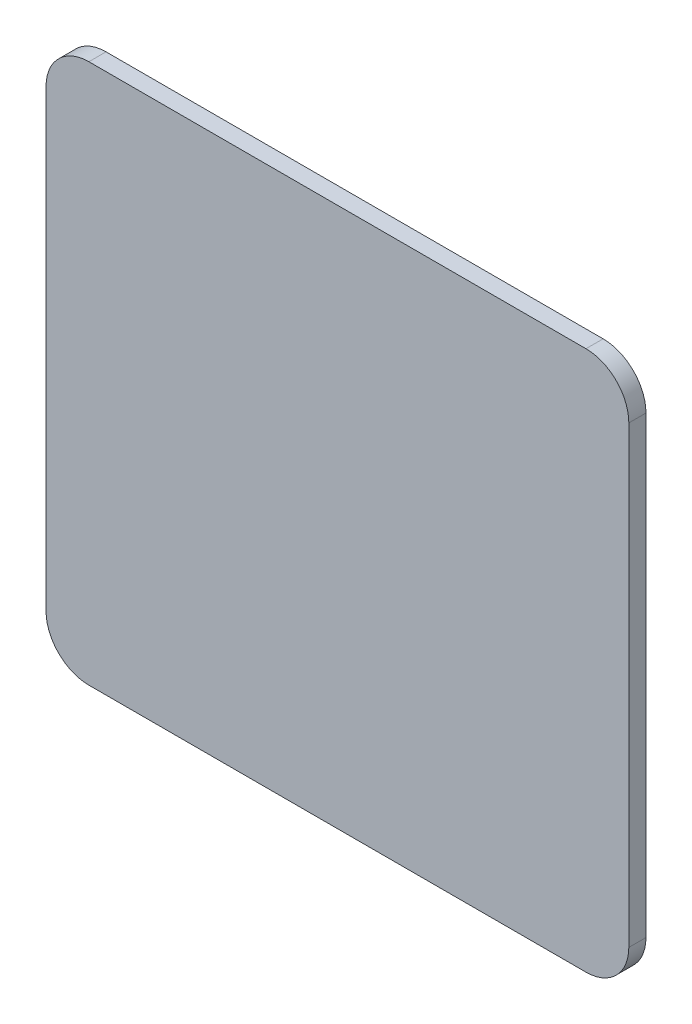
ISO-10303-21;
HEADER;
FILE_DESCRIPTION(('STEP AP214'),'2;1');
FILE_NAME('part.step','',(''),(''),'','','');
FILE_SCHEMA(('AUTOMOTIVE_DESIGN { 1 0 10303 214 1 1 1 1 }'));
ENDSEC;
DATA;
#1=APPLICATION_CONTEXT('core data for automotive mechanical design processes');
#2=APPLICATION_PROTOCOL_DEFINITION('international standard','automotive_design',2000,#1);
#3=PRODUCT_CONTEXT('',#1,'mechanical');
#4=PRODUCT('Part','Part','',(#3));
#5=PRODUCT_RELATED_PRODUCT_CATEGORY('part','',(#4));
#6=PRODUCT_DEFINITION_FORMATION('','',#4);
#7=PRODUCT_DEFINITION_CONTEXT('part definition',#1,'design');
#8=PRODUCT_DEFINITION('design','',#6,#7);
#9=PRODUCT_DEFINITION_SHAPE('','',#8);
#10=(LENGTH_UNIT() NAMED_UNIT(*) SI_UNIT(.MILLI.,.METRE.));
#11=(NAMED_UNIT(*) PLANE_ANGLE_UNIT() SI_UNIT($,.RADIAN.));
#12=(NAMED_UNIT(*) SI_UNIT($,.STERADIAN.) SOLID_ANGLE_UNIT());
#13=UNCERTAINTY_MEASURE_WITH_UNIT(LENGTH_MEASURE(1.E-05),#10,'distance_accuracy_value','');
#14=(GEOMETRIC_REPRESENTATION_CONTEXT(3) GLOBAL_UNCERTAINTY_ASSIGNED_CONTEXT((#13)) GLOBAL_UNIT_ASSIGNED_CONTEXT((#10,
#11,#12)) REPRESENTATION_CONTEXT('',''));
#15=CARTESIAN_POINT('',(0.,0.,0.));
#16=DIRECTION('',(0.,0.,1.));
#17=DIRECTION('',(1.,0.,0.));
#18=AXIS2_PLACEMENT_3D('',#15,#16,#17);
#19=CARTESIAN_POINT('',(-9.74647887323944,14.4401408450704,1.));
#20=DIRECTION('',(0.,0.,-1.));
#21=DIRECTION('',(-1.,0.,0.));
#22=AXIS2_PLACEMENT_3D('',#19,#20,#21);
#23=CYLINDRICAL_SURFACE('',#22,2.5);
#24=CARTESIAN_POINT('',(-9.74647887323944,14.4401408450704,0.));
#25=DIRECTION('',(0.,0.,1.));
#26=DIRECTION('',(1.,0.,0.));
#27=AXIS2_PLACEMENT_3D('',#24,#25,#26);
#28=CIRCLE('',#27,2.5);
#29=CARTESIAN_POINT('',(-9.74647887323942,16.9401408450704,0.));
#30=VERTEX_POINT('',#29);
#31=CARTESIAN_POINT('',(-12.2464788732394,14.4401408450704,0.));
#32=VERTEX_POINT('',#31);
#33=EDGE_CURVE('E129',#30,#32,#28,.T.);
#34=ORIENTED_EDGE('',*,*,#33,.T.);
#35=DIRECTION('',(0.,0.,-1.));
#36=VECTOR('',#35,1.);
#37=CARTESIAN_POINT('',(-12.2464788732394,14.4401408450704,1.));
#38=LINE('',#37,#36);
#39=CARTESIAN_POINT('',(-12.2464788732394,14.4401408450704,1.));
#40=VERTEX_POINT('',#39);
#41=EDGE_CURVE('E11',#40,#32,#38,.T.);
#42=ORIENTED_EDGE('',*,*,#41,.F.);
#43=CARTESIAN_POINT('',(-9.74647887323944,14.4401408450704,1.));
#44=DIRECTION('',(0.,0.,1.));
#45=DIRECTION('',(1.,0.,0.));
#46=AXIS2_PLACEMENT_3D('',#43,#44,#45);
#47=CIRCLE('',#46,2.5);
#48=CARTESIAN_POINT('',(-9.74647887323942,16.9401408450704,1.));
#49=VERTEX_POINT('',#48);
#50=EDGE_CURVE('E143',#49,#40,#47,.T.);
#51=ORIENTED_EDGE('',*,*,#50,.F.);
#52=DIRECTION('',(0.,0.,-1.));
#53=VECTOR('',#52,1.);
#54=CARTESIAN_POINT('',(-9.74647887323942,16.9401408450704,1.));
#55=LINE('',#54,#53);
#56=EDGE_CURVE('E125',#49,#30,#55,.T.);
#57=ORIENTED_EDGE('',*,*,#56,.T.);
#58=EDGE_LOOP('',(#34,#42,#51,#57));
#59=FACE_BOUND('',#58,.T.);
#60=ADVANCED_FACE('F33',(#59),#23,.T.);
#61=CARTESIAN_POINT('',(-12.2464788732394,14.4401408450704,1.));
#62=DIRECTION('',(1.,0.,0.));
#63=DIRECTION('',(0.,1.,0.));
#64=AXIS2_PLACEMENT_3D('',#61,#62,#63);
#65=PLANE('',#64);
#66=DIRECTION('',(0.,-1.,0.));
#67=VECTOR('',#66,1.);
#68=CARTESIAN_POINT('',(-12.2464788732394,14.4401408450704,0.));
#69=LINE('',#68,#67);
#70=CARTESIAN_POINT('',(-12.2464788732394,-12.0598591549296,0.));
#71=VERTEX_POINT('',#70);
#72=EDGE_CURVE('E132',#32,#71,#69,.T.);
#73=ORIENTED_EDGE('',*,*,#72,.T.);
#74=DIRECTION('',(0.,0.,-1.));
#75=VECTOR('',#74,1.);
#76=CARTESIAN_POINT('',(-12.2464788732394,-12.0598591549296,1.));
#77=LINE('',#76,#75);
#78=CARTESIAN_POINT('',(-12.2464788732394,-12.0598591549296,1.));
#79=VERTEX_POINT('',#78);
#80=EDGE_CURVE('E41',#79,#71,#77,.T.);
#81=ORIENTED_EDGE('',*,*,#80,.F.);
#82=DIRECTION('',(0.,-1.,0.));
#83=VECTOR('',#82,1.);
#84=CARTESIAN_POINT('',(-12.2464788732394,14.4401408450704,1.));
#85=LINE('',#84,#83);
#86=EDGE_CURVE('E92',#40,#79,#85,.T.);
#87=ORIENTED_EDGE('',*,*,#86,.F.);
#88=ORIENTED_EDGE('',*,*,#41,.T.);
#89=EDGE_LOOP('',(#73,#81,#87,#88));
#90=FACE_BOUND('',#89,.T.);
#91=ADVANCED_FACE('F178',(#90),#65,.F.);
#92=CARTESIAN_POINT('',(-9.74647887323944,-12.0598591549296,1.));
#93=DIRECTION('',(0.,0.,-1.));
#94=DIRECTION('',(-1.,0.,0.));
#95=AXIS2_PLACEMENT_3D('',#92,#93,#94);
#96=CYLINDRICAL_SURFACE('',#95,2.5);
#97=CARTESIAN_POINT('',(-9.74647887323944,-12.0598591549296,0.));
#98=DIRECTION('',(0.,0.,1.));
#99=DIRECTION('',(1.,0.,0.));
#100=AXIS2_PLACEMENT_3D('',#97,#98,#99);
#101=CIRCLE('',#100,2.5);
#102=CARTESIAN_POINT('',(-9.74647887323941,-14.5598591549296,0.));
#103=VERTEX_POINT('',#102);
#104=EDGE_CURVE('E134',#71,#103,#101,.T.);
#105=ORIENTED_EDGE('',*,*,#104,.T.);
#106=DIRECTION('',(0.,0.,-1.));
#107=VECTOR('',#106,1.);
#108=CARTESIAN_POINT('',(-9.74647887323941,-14.5598591549296,1.));
#109=LINE('',#108,#107);
#110=CARTESIAN_POINT('',(-9.74647887323941,-14.5598591549296,1.));
#111=VERTEX_POINT('',#110);
#112=EDGE_CURVE('E150',#111,#103,#109,.T.);
#113=ORIENTED_EDGE('',*,*,#112,.F.);
#114=CARTESIAN_POINT('',(-9.74647887323944,-12.0598591549296,1.));
#115=DIRECTION('',(0.,0.,1.));
#116=DIRECTION('',(1.,0.,0.));
#117=AXIS2_PLACEMENT_3D('',#114,#115,#116);
#118=CIRCLE('',#117,2.5);
#119=EDGE_CURVE('E158',#79,#111,#118,.T.);
#120=ORIENTED_EDGE('',*,*,#119,.F.);
#121=ORIENTED_EDGE('',*,*,#80,.T.);
#122=EDGE_LOOP('',(#105,#113,#120,#121));
#123=FACE_BOUND('',#122,.T.);
#124=ADVANCED_FACE('F156',(#123),#96,.T.);
#125=CARTESIAN_POINT('',(-9.74647887323941,-14.5598591549296,1.));
#126=DIRECTION('',(0.,1.,0.));
#127=DIRECTION('',(0.,0.,1.));
#128=AXIS2_PLACEMENT_3D('',#125,#126,#127);
#129=PLANE('',#128);
#130=DIRECTION('',(1.,0.,0.));
#131=VECTOR('',#130,1.);
#132=CARTESIAN_POINT('',(-9.74647887323941,-14.5598591549296,0.));
#133=LINE('',#132,#131);
#134=CARTESIAN_POINT('',(19.2535211267605,-14.5598591549296,0.));
#135=VERTEX_POINT('',#134);
#136=EDGE_CURVE('E136',#103,#135,#133,.T.);
#137=ORIENTED_EDGE('',*,*,#136,.T.);
#138=DIRECTION('',(0.,0.,-1.));
#139=VECTOR('',#138,1.);
#140=CARTESIAN_POINT('',(19.2535211267605,-14.5598591549296,1.));
#141=LINE('',#140,#139);
#142=CARTESIAN_POINT('',(19.2535211267605,-14.5598591549296,1.));
#143=VERTEX_POINT('',#142);
#144=EDGE_CURVE('E147',#143,#135,#141,.T.);
#145=ORIENTED_EDGE('',*,*,#144,.F.);
#146=DIRECTION('',(1.,0.,0.));
#147=VECTOR('',#146,1.);
#148=CARTESIAN_POINT('',(-9.74647887323941,-14.5598591549296,1.));
#149=LINE('',#148,#147);
#150=EDGE_CURVE('E170',#111,#143,#149,.T.);
#151=ORIENTED_EDGE('',*,*,#150,.F.);
#152=ORIENTED_EDGE('',*,*,#112,.T.);
#153=EDGE_LOOP('',(#137,#145,#151,#152));
#154=FACE_BOUND('',#153,.T.);
#155=ADVANCED_FACE('F166',(#154),#129,.F.);
#156=CARTESIAN_POINT('',(19.2535211267606,-12.0598591549296,1.));
#157=DIRECTION('',(0.,0.,-1.));
#158=DIRECTION('',(-1.,0.,0.));
#159=AXIS2_PLACEMENT_3D('',#156,#157,#158);
#160=CYLINDRICAL_SURFACE('',#159,2.5);
#161=CARTESIAN_POINT('',(19.2535211267606,-12.0598591549296,0.));
#162=DIRECTION('',(0.,0.,1.));
#163=DIRECTION('',(1.,0.,0.));
#164=AXIS2_PLACEMENT_3D('',#161,#162,#163);
#165=CIRCLE('',#164,2.5);
#166=CARTESIAN_POINT('',(21.7535211267605,-12.0598591549296,0.));
#167=VERTEX_POINT('',#166);
#168=EDGE_CURVE('E138',#135,#167,#165,.T.);
#169=ORIENTED_EDGE('',*,*,#168,.T.);
#170=DIRECTION('',(0.,0.,-1.));
#171=VECTOR('',#170,1.);
#172=CARTESIAN_POINT('',(21.7535211267605,-12.0598591549296,1.));
#173=LINE('',#172,#171);
#174=CARTESIAN_POINT('',(21.7535211267605,-12.0598591549296,1.));
#175=VERTEX_POINT('',#174);
#176=EDGE_CURVE('E120',#175,#167,#173,.T.);
#177=ORIENTED_EDGE('',*,*,#176,.F.);
#178=CARTESIAN_POINT('',(19.2535211267606,-12.0598591549296,1.));
#179=DIRECTION('',(0.,0.,1.));
#180=DIRECTION('',(1.,0.,0.));
#181=AXIS2_PLACEMENT_3D('',#178,#179,#180);
#182=CIRCLE('',#181,2.5);
#183=EDGE_CURVE('E111',#143,#175,#182,.T.);
#184=ORIENTED_EDGE('',*,*,#183,.F.);
#185=ORIENTED_EDGE('',*,*,#144,.T.);
#186=EDGE_LOOP('',(#169,#177,#184,#185));
#187=FACE_BOUND('',#186,.T.);
#188=ADVANCED_FACE('F169',(#187),#160,.T.);
#189=CARTESIAN_POINT('',(21.7535211267605,14.4401408450704,1.));
#190=DIRECTION('',(-1.,0.,0.));
#191=DIRECTION('',(0.,0.,1.));
#192=AXIS2_PLACEMENT_3D('',#189,#190,#191);
#193=PLANE('',#192);
#194=DIRECTION('',(0.,1.,0.));
#195=VECTOR('',#194,1.);
#196=CARTESIAN_POINT('',(21.7535211267605,14.4401408450704,0.));
#197=LINE('',#196,#195);
#198=CARTESIAN_POINT('',(21.7535211267605,14.4401408450704,0.));
#199=VERTEX_POINT('',#198);
#200=EDGE_CURVE('E119',#167,#199,#197,.T.);
#201=ORIENTED_EDGE('',*,*,#200,.T.);
#202=DIRECTION('',(0.,0.,-1.));
#203=VECTOR('',#202,1.);
#204=CARTESIAN_POINT('',(21.7535211267605,14.4401408450704,1.));
#205=LINE('',#204,#203);
#206=CARTESIAN_POINT('',(21.7535211267605,14.4401408450704,1.));
#207=VERTEX_POINT('',#206);
#208=EDGE_CURVE('E116',#207,#199,#205,.T.);
#209=ORIENTED_EDGE('',*,*,#208,.F.);
#210=DIRECTION('',(0.,1.,0.));
#211=VECTOR('',#210,1.);
#212=CARTESIAN_POINT('',(21.7535211267605,14.4401408450704,1.));
#213=LINE('',#212,#211);
#214=EDGE_CURVE('E105',#175,#207,#213,.T.);
#215=ORIENTED_EDGE('',*,*,#214,.F.);
#216=ORIENTED_EDGE('',*,*,#176,.T.);
#217=EDGE_LOOP('',(#201,#209,#215,#216));
#218=FACE_BOUND('',#217,.T.);
#219=ADVANCED_FACE('F117',(#218),#193,.F.);
#220=CARTESIAN_POINT('',(19.2535211267606,14.4401408450704,1.));
#221=DIRECTION('',(0.,0.,-1.));
#222=DIRECTION('',(-1.,0.,0.));
#223=AXIS2_PLACEMENT_3D('',#220,#221,#222);
#224=CYLINDRICAL_SURFACE('',#223,2.5);
#225=CARTESIAN_POINT('',(19.2535211267606,14.4401408450704,0.));
#226=DIRECTION('',(0.,0.,1.));
#227=DIRECTION('',(-1.,0.,0.));
#228=AXIS2_PLACEMENT_3D('',#225,#226,#227);
#229=CIRCLE('',#228,2.5);
#230=CARTESIAN_POINT('',(19.2535211267605,16.9401408450704,0.));
#231=VERTEX_POINT('',#230);
#232=EDGE_CURVE('E78',#199,#231,#229,.T.);
#233=ORIENTED_EDGE('',*,*,#232,.T.);
#234=DIRECTION('',(0.,0.,-1.));
#235=VECTOR('',#234,1.);
#236=CARTESIAN_POINT('',(19.2535211267605,16.9401408450704,1.));
#237=LINE('',#236,#235);
#238=CARTESIAN_POINT('',(19.2535211267605,16.9401408450704,1.));
#239=VERTEX_POINT('',#238);
#240=EDGE_CURVE('E121',#239,#231,#237,.T.);
#241=ORIENTED_EDGE('',*,*,#240,.F.);
#242=CARTESIAN_POINT('',(19.2535211267606,14.4401408450704,1.));
#243=DIRECTION('',(0.,0.,1.));
#244=DIRECTION('',(-1.,0.,0.));
#245=AXIS2_PLACEMENT_3D('',#242,#243,#244);
#246=CIRCLE('',#245,2.5);
#247=EDGE_CURVE('E109',#207,#239,#246,.T.);
#248=ORIENTED_EDGE('',*,*,#247,.F.);
#249=ORIENTED_EDGE('',*,*,#208,.T.);
#250=EDGE_LOOP('',(#233,#241,#248,#249));
#251=FACE_BOUND('',#250,.T.);
#252=ADVANCED_FACE('F123',(#251),#224,.T.);
#253=CARTESIAN_POINT('',(-9.74647887323942,16.9401408450704,1.));
#254=DIRECTION('',(0.,-1.,0.));
#255=DIRECTION('',(0.,0.,-1.));
#256=AXIS2_PLACEMENT_3D('',#253,#254,#255);
#257=PLANE('',#256);
#258=DIRECTION('',(-1.,0.,0.));
#259=VECTOR('',#258,1.);
#260=CARTESIAN_POINT('',(-9.74647887323942,16.9401408450704,0.));
#261=LINE('',#260,#259);
#262=EDGE_CURVE('E84',#231,#30,#261,.T.);
#263=ORIENTED_EDGE('',*,*,#262,.T.);
#264=ORIENTED_EDGE('',*,*,#56,.F.);
#265=DIRECTION('',(-1.,0.,0.));
#266=VECTOR('',#265,1.);
#267=CARTESIAN_POINT('',(-9.74647887323942,16.9401408450704,1.));
#268=LINE('',#267,#266);
#269=EDGE_CURVE('E49',#239,#49,#268,.T.);
#270=ORIENTED_EDGE('',*,*,#269,.F.);
#271=ORIENTED_EDGE('',*,*,#240,.T.);
#272=EDGE_LOOP('',(#263,#264,#270,#271));
#273=FACE_BOUND('',#272,.T.);
#274=ADVANCED_FACE('F194',(#273),#257,.F.);
#275=CARTESIAN_POINT('',(-9.74647887323944,14.4401408450704,1.));
#276=DIRECTION('',(0.,0.,1.));
#277=DIRECTION('',(1.,0.,0.));
#278=AXIS2_PLACEMENT_3D('',#275,#276,#277);
#279=PLANE('',#278);
#280=ORIENTED_EDGE('',*,*,#50,.T.);
#281=ORIENTED_EDGE('',*,*,#86,.T.);
#282=ORIENTED_EDGE('',*,*,#119,.T.);
#283=ORIENTED_EDGE('',*,*,#150,.T.);
#284=ORIENTED_EDGE('',*,*,#183,.T.);
#285=ORIENTED_EDGE('',*,*,#214,.T.);
#286=ORIENTED_EDGE('',*,*,#247,.T.);
#287=ORIENTED_EDGE('',*,*,#269,.T.);
#288=EDGE_LOOP('',(#280,#281,#282,#283,#284,#285,#286,#287));
#289=FACE_BOUND('',#288,.T.);
#290=ADVANCED_FACE('F107',(#289),#279,.T.);
#291=CARTESIAN_POINT('',(-9.74647887323944,14.4401408450704,0.));
#292=DIRECTION('',(0.,0.,1.));
#293=DIRECTION('',(1.,0.,0.));
#294=AXIS2_PLACEMENT_3D('',#291,#292,#293);
#295=PLANE('',#294);
#296=ORIENTED_EDGE('',*,*,#33,.F.);
#297=ORIENTED_EDGE('',*,*,#262,.F.);
#298=ORIENTED_EDGE('',*,*,#232,.F.);
#299=ORIENTED_EDGE('',*,*,#200,.F.);
#300=ORIENTED_EDGE('',*,*,#168,.F.);
#301=ORIENTED_EDGE('',*,*,#136,.F.);
#302=ORIENTED_EDGE('',*,*,#104,.F.);
#303=ORIENTED_EDGE('',*,*,#72,.F.);
#304=EDGE_LOOP('',(#296,#297,#298,#299,#300,#301,#302,#303));
#305=FACE_BOUND('',#304,.T.);
#306=ADVANCED_FACE('F162',(#305),#295,.F.);
#307=CLOSED_SHELL('',(#60,#91,#124,#155,#188,#219,#252,#274,#290,#306));
#308=MANIFOLD_SOLID_BREP('B2',#307);
#309=ADVANCED_BREP_SHAPE_REPRESENTATION('',(#18,#308),#14);
#310=SHAPE_DEFINITION_REPRESENTATION(#9,#309);
ENDSEC;
END-ISO-10303-21;
